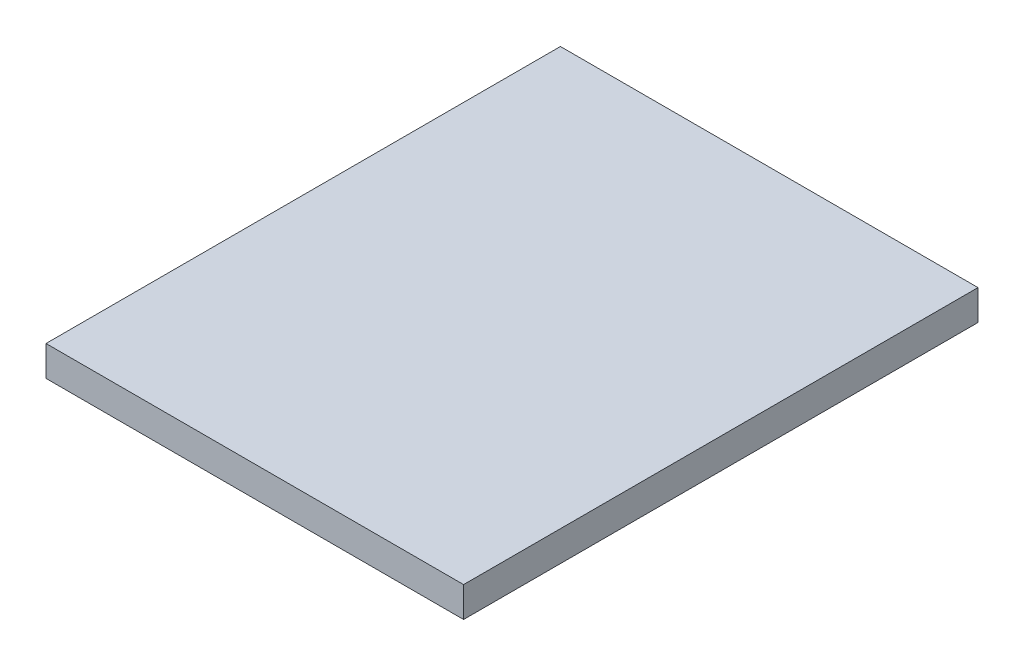
ISO-10303-21;
HEADER;
FILE_DESCRIPTION(('STEP AP214'),'2;1');
FILE_NAME('part.step','',(''),(''),'','','');
FILE_SCHEMA(('AUTOMOTIVE_DESIGN { 1 0 10303 214 1 1 1 1 }'));
ENDSEC;
DATA;
#1=APPLICATION_CONTEXT('core data for automotive mechanical design processes');
#2=APPLICATION_PROTOCOL_DEFINITION('international standard','automotive_design',2000,#1);
#3=PRODUCT_CONTEXT('',#1,'mechanical');
#4=PRODUCT('Part','Part','',(#3));
#5=PRODUCT_RELATED_PRODUCT_CATEGORY('part','',(#4));
#6=PRODUCT_DEFINITION_FORMATION('','',#4);
#7=PRODUCT_DEFINITION_CONTEXT('part definition',#1,'design');
#8=PRODUCT_DEFINITION('design','',#6,#7);
#9=PRODUCT_DEFINITION_SHAPE('','',#8);
#10=(LENGTH_UNIT() NAMED_UNIT(*) SI_UNIT(.MILLI.,.METRE.));
#11=(NAMED_UNIT(*) PLANE_ANGLE_UNIT() SI_UNIT($,.RADIAN.));
#12=(NAMED_UNIT(*) SI_UNIT($,.STERADIAN.) SOLID_ANGLE_UNIT());
#13=UNCERTAINTY_MEASURE_WITH_UNIT(LENGTH_MEASURE(1.E-05),#10,'distance_accuracy_value','');
#14=(GEOMETRIC_REPRESENTATION_CONTEXT(3) GLOBAL_UNCERTAINTY_ASSIGNED_CONTEXT((#13)) GLOBAL_UNIT_ASSIGNED_CONTEXT((#10,
#11,#12)) REPRESENTATION_CONTEXT('',''));
#15=CARTESIAN_POINT('',(0.,0.,0.));
#16=DIRECTION('',(0.,0.,1.));
#17=DIRECTION('',(1.,0.,0.));
#18=AXIS2_PLACEMENT_3D('',#15,#16,#17);
#19=CARTESIAN_POINT('',(-35.0999999999998,-11.4169897099192,66.9999999999999));
#20=DIRECTION('',(1.,0.,0.));
#21=DIRECTION('',(0.,1.,0.));
#22=AXIS2_PLACEMENT_3D('',#19,#20,#21);
#23=PLANE('',#22);
#24=DIRECTION('',(-1.7694179454962E-13,-1.,0.));
#25=VECTOR('',#24,1.);
#26=CARTESIAN_POINT('',(-35.1000000000001,-14.4169897099192,8.00000000000023));
#27=LINE('',#26,#25);
#28=CARTESIAN_POINT('',(-35.1,-12.9169897099191,8.00000000000004));
#29=VERTEX_POINT('',#28);
#30=CARTESIAN_POINT('',(-35.1,-15.9169897099192,8.00000000000005));
#31=VERTEX_POINT('',#30);
#32=EDGE_CURVE('E13',#29,#31,#27,.T.);
#33=ORIENTED_EDGE('',*,*,#32,.T.);
#34=DIRECTION('',(1.66941623923415E-13,0.,-1.));
#35=VECTOR('',#34,1.);
#36=CARTESIAN_POINT('',(-35.0999999999992,-15.9169897099193,33.5000000000008));
#37=LINE('',#36,#35);
#38=CARTESIAN_POINT('',(-35.0999999999996,-15.9169897099193,59.0000000000002));
#39=VERTEX_POINT('',#38);
#40=EDGE_CURVE('E251',#39,#31,#37,.T.);
#41=ORIENTED_EDGE('',*,*,#40,.F.);
#42=DIRECTION('',(-1.38777878078147E-13,-1.,3.33066907387552E-13));
#43=VECTOR('',#42,1.);
#44=CARTESIAN_POINT('',(-35.0999999999997,-14.4169897099192,59.0000000000003));
#45=LINE('',#44,#43);
#46=CARTESIAN_POINT('',(-35.0999999999996,-12.9169897099192,59.0000000000002));
#47=VERTEX_POINT('',#46);
#48=EDGE_CURVE('E239',#47,#39,#45,.T.);
#49=ORIENTED_EDGE('',*,*,#48,.F.);
#50=DIRECTION('',(2.11432178954265E-13,0.,-1.));
#51=VECTOR('',#50,1.);
#52=CARTESIAN_POINT('',(-35.099999999999,-12.9169897099191,33.499999999999));
#53=LINE('',#52,#51);
#54=EDGE_CURVE('E190',#47,#29,#53,.T.);
#55=ORIENTED_EDGE('',*,*,#54,.T.);
#56=EDGE_LOOP('',(#33,#41,#49,#55));
#57=FACE_BOUND('',#56,.T.);
#58=ADVANCED_FACE('F179',(#57),#23,.F.);
#59=CARTESIAN_POINT('',(-27.9,-15.9169897099191,67.));
#60=DIRECTION('',(0.,1.,0.));
#61=DIRECTION('',(0.,0.,1.));
#62=AXIS2_PLACEMENT_3D('',#59,#60,#61);
#63=PLANE('',#62);
#64=DIRECTION('',(1.,0.,0.));
#65=VECTOR('',#64,1.);
#66=CARTESIAN_POINT('',(-14.4000000000014,-15.9169897099195,8.00000000000031));
#67=LINE('',#66,#65);
#68=CARTESIAN_POINT('',(6.29999999999963,-15.916989709919,8.00000000000038));
#69=VERTEX_POINT('',#68);
#70=EDGE_CURVE('E199',#31,#69,#67,.T.);
#71=ORIENTED_EDGE('',*,*,#70,.T.);
#72=DIRECTION('',(0.,0.,-1.));
#73=VECTOR('',#72,1.);
#74=CARTESIAN_POINT('',(6.30000000000015,-15.9169897099187,33.5000000000024));
#75=LINE('',#74,#73);
#76=CARTESIAN_POINT('',(6.30000000000037,-15.9169897099191,59.0000000000005));
#77=VERTEX_POINT('',#76);
#78=EDGE_CURVE('E254',#77,#69,#75,.T.);
#79=ORIENTED_EDGE('',*,*,#78,.F.);
#80=DIRECTION('',(1.,0.,0.));
#81=VECTOR('',#80,1.);
#82=CARTESIAN_POINT('',(-14.4000000000006,-15.916989709919,58.9999999999998));
#83=LINE('',#82,#81);
#84=EDGE_CURVE('E228',#39,#77,#83,.T.);
#85=ORIENTED_EDGE('',*,*,#84,.F.);
#86=ORIENTED_EDGE('',*,*,#40,.T.);
#87=EDGE_LOOP('',(#71,#79,#85,#86));
#88=FACE_BOUND('',#87,.T.);
#89=ADVANCED_FACE('F275',(#88),#63,.F.);
#90=CARTESIAN_POINT('',(6.3000000000002,-11.416989709919,67.0000000000001));
#91=DIRECTION('',(-1.,0.,0.));
#92=DIRECTION('',(0.,0.,1.));
#93=AXIS2_PLACEMENT_3D('',#90,#91,#92);
#94=PLANE('',#93);
#95=DIRECTION('',(0.,1.,0.));
#96=VECTOR('',#95,1.);
#97=CARTESIAN_POINT('',(6.30000000000001,-14.416989709919,8.00000000000038));
#98=LINE('',#97,#96);
#99=CARTESIAN_POINT('',(6.29999999999964,-12.9169897099189,8.00000000000037));
#100=VERTEX_POINT('',#99);
#101=EDGE_CURVE('E236',#69,#100,#98,.T.);
#102=ORIENTED_EDGE('',*,*,#101,.T.);
#103=DIRECTION('',(0.,0.,-1.));
#104=VECTOR('',#103,1.);
#105=CARTESIAN_POINT('',(6.30000000000029,-12.9169897099185,33.4999999999916));
#106=LINE('',#105,#104);
#107=CARTESIAN_POINT('',(6.30000000000039,-12.9169897099191,59.0000000000005));
#108=VERTEX_POINT('',#107);
#109=EDGE_CURVE('E183',#108,#100,#106,.T.);
#110=ORIENTED_EDGE('',*,*,#109,.F.);
#111=DIRECTION('',(0.,1.,4.16333634234462E-13));
#112=VECTOR('',#111,1.);
#113=CARTESIAN_POINT('',(6.30000000000039,-14.4169897099191,59.0000000000004));
#114=LINE('',#113,#112);
#115=EDGE_CURVE('E222',#77,#108,#114,.T.);
#116=ORIENTED_EDGE('',*,*,#115,.F.);
#117=ORIENTED_EDGE('',*,*,#78,.T.);
#118=EDGE_LOOP('',(#102,#110,#116,#117));
#119=FACE_BOUND('',#118,.T.);
#120=ADVANCED_FACE('F235',(#119),#94,.F.);
#121=CARTESIAN_POINT('',(-27.9,-12.9169897099191,67.));
#122=DIRECTION('',(0.,-1.,0.));
#123=DIRECTION('',(0.,0.,-1.));
#124=AXIS2_PLACEMENT_3D('',#121,#122,#123);
#125=PLANE('',#124);
#126=DIRECTION('',(-1.,0.,0.));
#127=VECTOR('',#126,1.);
#128=CARTESIAN_POINT('',(-14.4000000000005,-12.9169897099194,8.00000000000029));
#129=LINE('',#128,#127);
#130=EDGE_CURVE('E216',#100,#29,#129,.T.);
#131=ORIENTED_EDGE('',*,*,#130,.T.);
#132=ORIENTED_EDGE('',*,*,#54,.F.);
#133=DIRECTION('',(-1.,0.,-1.86042807568525E-13));
#134=VECTOR('',#133,1.);
#135=CARTESIAN_POINT('',(-14.4000000000004,-12.9169897099192,58.9999999999994));
#136=LINE('',#135,#134);
#137=EDGE_CURVE('E226',#108,#47,#136,.T.);
#138=ORIENTED_EDGE('',*,*,#137,.F.);
#139=ORIENTED_EDGE('',*,*,#109,.T.);
#140=EDGE_LOOP('',(#131,#132,#138,#139));
#141=FACE_BOUND('',#140,.T.);
#142=ADVANCED_FACE('F241',(#141),#125,.F.);
#143=CARTESIAN_POINT('',(1.92554305833426E-13,0.,59.0000000000003));
#144=DIRECTION('',(0.,0.,1.));
#145=DIRECTION('',(1.,0.,0.));
#146=AXIS2_PLACEMENT_3D('',#143,#144,#145);
#147=PLANE('',#146);
#148=ORIENTED_EDGE('',*,*,#48,.T.);
#149=ORIENTED_EDGE('',*,*,#84,.T.);
#150=ORIENTED_EDGE('',*,*,#115,.T.);
#151=ORIENTED_EDGE('',*,*,#137,.T.);
#152=EDGE_LOOP('',(#148,#149,#150,#151));
#153=FACE_BOUND('',#152,.T.);
#154=ADVANCED_FACE('F224',(#153),#147,.T.);
#155=CARTESIAN_POINT('',(-1.92554305833426E-13,0.,8.0000000000003));
#156=DIRECTION('',(0.,0.,1.));
#157=DIRECTION('',(1.,0.,0.));
#158=AXIS2_PLACEMENT_3D('',#155,#156,#157);
#159=PLANE('',#158);
#160=ORIENTED_EDGE('',*,*,#32,.F.);
#161=ORIENTED_EDGE('',*,*,#130,.F.);
#162=ORIENTED_EDGE('',*,*,#101,.F.);
#163=ORIENTED_EDGE('',*,*,#70,.F.);
#164=EDGE_LOOP('',(#160,#161,#162,#163));
#165=FACE_BOUND('',#164,.T.);
#166=ADVANCED_FACE('F181',(#165),#159,.F.);
#167=CLOSED_SHELL('',(#58,#89,#120,#142,#154,#166));
#168=MANIFOLD_SOLID_BREP('B2',#167);
#169=ADVANCED_BREP_SHAPE_REPRESENTATION('',(#18,#168),#14);
#170=SHAPE_DEFINITION_REPRESENTATION(#9,#169);
ENDSEC;
END-ISO-10303-21;
